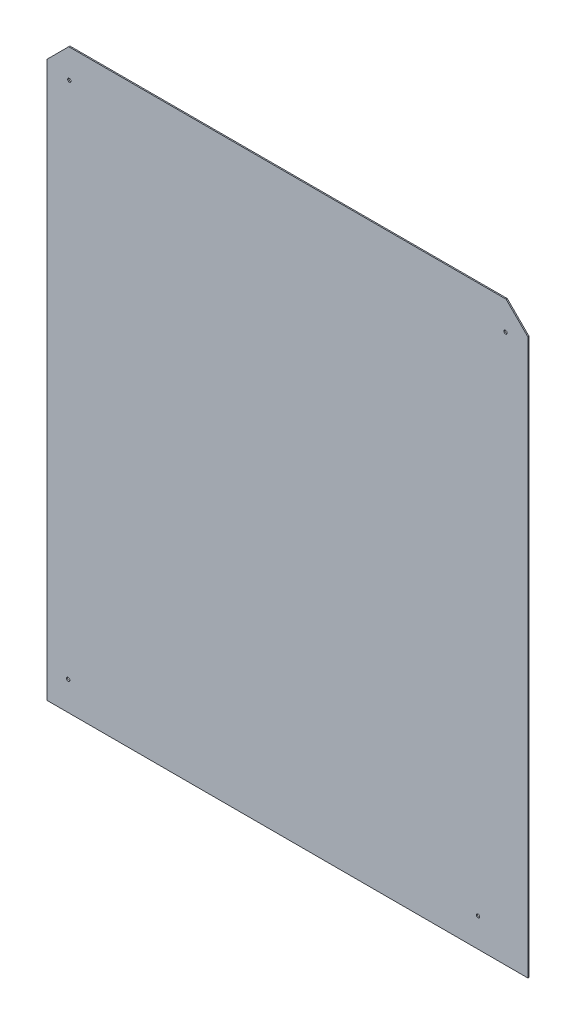
ISO-10303-21;
HEADER;
FILE_DESCRIPTION(('STEP AP214'),'2;1');
FILE_NAME('part.step','',(''),(''),'','','');
FILE_SCHEMA(('AUTOMOTIVE_DESIGN { 1 0 10303 214 1 1 1 1 }'));
ENDSEC;
DATA;
#1=APPLICATION_CONTEXT('core data for automotive mechanical design processes');
#2=APPLICATION_PROTOCOL_DEFINITION('international standard','automotive_design',2000,#1);
#3=PRODUCT_CONTEXT('',#1,'mechanical');
#4=PRODUCT('Part','Part','',(#3));
#5=PRODUCT_RELATED_PRODUCT_CATEGORY('part','',(#4));
#6=PRODUCT_DEFINITION_FORMATION('','',#4);
#7=PRODUCT_DEFINITION_CONTEXT('part definition',#1,'design');
#8=PRODUCT_DEFINITION('design','',#6,#7);
#9=PRODUCT_DEFINITION_SHAPE('','',#8);
#10=(LENGTH_UNIT() NAMED_UNIT(*) SI_UNIT(.MILLI.,.METRE.));
#11=(NAMED_UNIT(*) PLANE_ANGLE_UNIT() SI_UNIT($,.RADIAN.));
#12=(NAMED_UNIT(*) SI_UNIT($,.STERADIAN.) SOLID_ANGLE_UNIT());
#13=UNCERTAINTY_MEASURE_WITH_UNIT(LENGTH_MEASURE(1.E-05),#10,'distance_accuracy_value','');
#14=(GEOMETRIC_REPRESENTATION_CONTEXT(3) GLOBAL_UNCERTAINTY_ASSIGNED_CONTEXT((#13)) GLOBAL_UNIT_ASSIGNED_CONTEXT((#10,
#11,#12)) REPRESENTATION_CONTEXT('',''));
#15=CARTESIAN_POINT('',(0.,0.,0.));
#16=DIRECTION('',(0.,0.,1.));
#17=DIRECTION('',(1.,0.,0.));
#18=AXIS2_PLACEMENT_3D('',#15,#16,#17);
#19=CARTESIAN_POINT('',(0.,0.,-1.4));
#20=DIRECTION('',(-1.,0.,0.));
#21=DIRECTION('',(0.,0.,1.));
#22=AXIS2_PLACEMENT_3D('',#19,#20,#21);
#23=PLANE('',#22);
#24=DIRECTION('',(0.,-1.,0.));
#25=VECTOR('',#24,1.);
#26=CARTESIAN_POINT('',(0.,0.,0.));
#27=LINE('',#26,#25);
#28=CARTESIAN_POINT('',(0.,664.,0.));
#29=VERTEX_POINT('',#28);
#30=CARTESIAN_POINT('',(0.,0.,0.));
#31=VERTEX_POINT('',#30);
#32=EDGE_CURVE('E126',#29,#31,#27,.T.);
#33=ORIENTED_EDGE('',*,*,#32,.F.);
#34=DIRECTION('',(0.,0.,1.));
#35=VECTOR('',#34,1.);
#36=CARTESIAN_POINT('',(0.,664.,-1.4));
#37=LINE('',#36,#35);
#38=CARTESIAN_POINT('',(0.,664.,-1.4));
#39=VERTEX_POINT('',#38);
#40=EDGE_CURVE('E11',#39,#29,#37,.T.);
#41=ORIENTED_EDGE('',*,*,#40,.F.);
#42=DIRECTION('',(0.,-1.,0.));
#43=VECTOR('',#42,1.);
#44=CARTESIAN_POINT('',(0.,0.,-1.4));
#45=LINE('',#44,#43);
#46=CARTESIAN_POINT('',(0.,0.,-1.4));
#47=VERTEX_POINT('',#46);
#48=EDGE_CURVE('E141',#39,#47,#45,.T.);
#49=ORIENTED_EDGE('',*,*,#48,.T.);
#50=DIRECTION('',(0.,0.,1.));
#51=VECTOR('',#50,1.);
#52=CARTESIAN_POINT('',(0.,0.,-1.4));
#53=LINE('',#52,#51);
#54=EDGE_CURVE('E44',#47,#31,#53,.T.);
#55=ORIENTED_EDGE('',*,*,#54,.T.);
#56=EDGE_LOOP('',(#33,#41,#49,#55));
#57=FACE_BOUND('',#56,.T.);
#58=ADVANCED_FACE('F41',(#57),#23,.T.);
#59=CARTESIAN_POINT('',(0.,664.,-1.4));
#60=DIRECTION('',(-0.707106781186548,0.707106781186547,0.));
#61=DIRECTION('',(-0.707106781186547,-0.707106781186548,0.));
#62=AXIS2_PLACEMENT_3D('',#59,#60,#61);
#63=PLANE('',#62);
#64=DIRECTION('',(-0.707106781186547,-0.707106781186548,0.));
#65=VECTOR('',#64,1.);
#66=CARTESIAN_POINT('',(0.,664.,0.));
#67=LINE('',#66,#65);
#68=CARTESIAN_POINT('',(26.,690.,0.));
#69=VERTEX_POINT('',#68);
#70=EDGE_CURVE('E139',#69,#29,#67,.T.);
#71=ORIENTED_EDGE('',*,*,#70,.F.);
#72=DIRECTION('',(0.,0.,1.));
#73=VECTOR('',#72,1.);
#74=CARTESIAN_POINT('',(26.,690.,-1.4));
#75=LINE('',#74,#73);
#76=CARTESIAN_POINT('',(26.,690.,-1.4));
#77=VERTEX_POINT('',#76);
#78=EDGE_CURVE('E50',#77,#69,#75,.T.);
#79=ORIENTED_EDGE('',*,*,#78,.F.);
#80=DIRECTION('',(-0.707106781186547,-0.707106781186548,0.));
#81=VECTOR('',#80,1.);
#82=CARTESIAN_POINT('',(0.,664.,-1.4));
#83=LINE('',#82,#81);
#84=EDGE_CURVE('E116',#77,#39,#83,.T.);
#85=ORIENTED_EDGE('',*,*,#84,.T.);
#86=ORIENTED_EDGE('',*,*,#40,.T.);
#87=EDGE_LOOP('',(#71,#79,#85,#86));
#88=FACE_BOUND('',#87,.T.);
#89=ADVANCED_FACE('F149',(#88),#63,.T.);
#90=CARTESIAN_POINT('',(26.,690.,-1.4));
#91=DIRECTION('',(0.,1.,0.));
#92=DIRECTION('',(0.,0.,1.));
#93=AXIS2_PLACEMENT_3D('',#90,#91,#92);
#94=PLANE('',#93);
#95=DIRECTION('',(-1.,0.,0.));
#96=VECTOR('',#95,1.);
#97=CARTESIAN_POINT('',(26.,690.,0.));
#98=LINE('',#97,#96);
#99=CARTESIAN_POINT('',(549.,690.,0.));
#100=VERTEX_POINT('',#99);
#101=EDGE_CURVE('E103',#100,#69,#98,.T.);
#102=ORIENTED_EDGE('',*,*,#101,.F.);
#103=DIRECTION('',(0.,0.,1.));
#104=VECTOR('',#103,1.);
#105=CARTESIAN_POINT('',(549.,690.,-1.4));
#106=LINE('',#105,#104);
#107=CARTESIAN_POINT('',(549.,690.,-1.4));
#108=VERTEX_POINT('',#107);
#109=EDGE_CURVE('E98',#108,#100,#106,.T.);
#110=ORIENTED_EDGE('',*,*,#109,.F.);
#111=DIRECTION('',(-1.,0.,0.));
#112=VECTOR('',#111,1.);
#113=CARTESIAN_POINT('',(26.,690.,-1.4));
#114=LINE('',#113,#112);
#115=EDGE_CURVE('E101',#108,#77,#114,.T.);
#116=ORIENTED_EDGE('',*,*,#115,.T.);
#117=ORIENTED_EDGE('',*,*,#78,.T.);
#118=EDGE_LOOP('',(#102,#110,#116,#117));
#119=FACE_BOUND('',#118,.T.);
#120=ADVANCED_FACE('F100',(#119),#94,.T.);
#121=CARTESIAN_POINT('',(549.,690.,-1.4));
#122=DIRECTION('',(0.707106781186548,0.707106781186548,0.));
#123=DIRECTION('',(-0.707106781186548,0.707106781186548,0.));
#124=AXIS2_PLACEMENT_3D('',#121,#122,#123);
#125=PLANE('',#124);
#126=DIRECTION('',(-0.707106781186547,0.707106781186547,0.));
#127=VECTOR('',#126,1.);
#128=CARTESIAN_POINT('',(549.,690.,0.));
#129=LINE('',#128,#127);
#130=CARTESIAN_POINT('',(575.,664.,0.));
#131=VERTEX_POINT('',#130);
#132=EDGE_CURVE('E136',#131,#100,#129,.T.);
#133=ORIENTED_EDGE('',*,*,#132,.F.);
#134=DIRECTION('',(0.,0.,1.));
#135=VECTOR('',#134,1.);
#136=CARTESIAN_POINT('',(575.,664.,-1.4));
#137=LINE('',#136,#135);
#138=CARTESIAN_POINT('',(575.,664.,-1.4));
#139=VERTEX_POINT('',#138);
#140=EDGE_CURVE('E108',#139,#131,#137,.T.);
#141=ORIENTED_EDGE('',*,*,#140,.F.);
#142=DIRECTION('',(-0.707106781186547,0.707106781186547,0.));
#143=VECTOR('',#142,1.);
#144=CARTESIAN_POINT('',(549.,690.,-1.4));
#145=LINE('',#144,#143);
#146=EDGE_CURVE('E114',#139,#108,#145,.T.);
#147=ORIENTED_EDGE('',*,*,#146,.T.);
#148=ORIENTED_EDGE('',*,*,#109,.T.);
#149=EDGE_LOOP('',(#133,#141,#147,#148));
#150=FACE_BOUND('',#149,.T.);
#151=ADVANCED_FACE('F118',(#150),#125,.T.);
#152=CARTESIAN_POINT('',(575.,0.,-1.4));
#153=DIRECTION('',(1.,0.,0.));
#154=DIRECTION('',(0.,0.,-1.));
#155=AXIS2_PLACEMENT_3D('',#152,#153,#154);
#156=PLANE('',#155);
#157=DIRECTION('',(0.,1.,0.));
#158=VECTOR('',#157,1.);
#159=CARTESIAN_POINT('',(575.,0.,0.));
#160=LINE('',#159,#158);
#161=CARTESIAN_POINT('',(575.,0.,0.));
#162=VERTEX_POINT('',#161);
#163=EDGE_CURVE('E133',#162,#131,#160,.T.);
#164=ORIENTED_EDGE('',*,*,#163,.F.);
#165=DIRECTION('',(0.,0.,1.));
#166=VECTOR('',#165,1.);
#167=CARTESIAN_POINT('',(575.,0.,-1.4));
#168=LINE('',#167,#166);
#169=CARTESIAN_POINT('',(575.,0.,-1.4));
#170=VERTEX_POINT('',#169);
#171=EDGE_CURVE('E144',#170,#162,#168,.T.);
#172=ORIENTED_EDGE('',*,*,#171,.F.);
#173=DIRECTION('',(0.,1.,0.));
#174=VECTOR('',#173,1.);
#175=CARTESIAN_POINT('',(575.,0.,-1.4));
#176=LINE('',#175,#174);
#177=EDGE_CURVE('E119',#170,#139,#176,.T.);
#178=ORIENTED_EDGE('',*,*,#177,.T.);
#179=ORIENTED_EDGE('',*,*,#140,.T.);
#180=EDGE_LOOP('',(#164,#172,#178,#179));
#181=FACE_BOUND('',#180,.T.);
#182=ADVANCED_FACE('F162',(#181),#156,.T.);
#183=CARTESIAN_POINT('',(0.,0.,-1.4));
#184=DIRECTION('',(0.,-1.,0.));
#185=DIRECTION('',(0.,0.,-1.));
#186=AXIS2_PLACEMENT_3D('',#183,#184,#185);
#187=PLANE('',#186);
#188=DIRECTION('',(1.,0.,0.));
#189=VECTOR('',#188,1.);
#190=CARTESIAN_POINT('',(0.,0.,0.));
#191=LINE('',#190,#189);
#192=EDGE_CURVE('E129',#31,#162,#191,.T.);
#193=ORIENTED_EDGE('',*,*,#192,.F.);
#194=ORIENTED_EDGE('',*,*,#54,.F.);
#195=DIRECTION('',(1.,0.,0.));
#196=VECTOR('',#195,1.);
#197=CARTESIAN_POINT('',(0.,0.,-1.4));
#198=LINE('',#197,#196);
#199=EDGE_CURVE('E121',#47,#170,#198,.T.);
#200=ORIENTED_EDGE('',*,*,#199,.T.);
#201=ORIENTED_EDGE('',*,*,#171,.T.);
#202=EDGE_LOOP('',(#193,#194,#200,#201));
#203=FACE_BOUND('',#202,.T.);
#204=ADVANCED_FACE('F146',(#203),#187,.T.);
#205=CARTESIAN_POINT('',(0.,0.,-1.4));
#206=DIRECTION('',(0.,0.,-1.));
#207=DIRECTION('',(-1.,0.,0.));
#208=AXIS2_PLACEMENT_3D('',#205,#206,#207);
#209=PLANE('',#208);
#210=CARTESIAN_POINT('',(548.3,655.5,-1.4));
#211=DIRECTION('',(0.,0.,-1.));
#212=DIRECTION('',(-1.,0.,0.));
#213=AXIS2_PLACEMENT_3D('',#210,#211,#212);
#214=CIRCLE('',#213,2.);
#215=CARTESIAN_POINT('',(546.3,655.5,-1.4));
#216=VERTEX_POINT('',#215);
#217=EDGE_CURVE('E213',#216,#216,#214,.F.);
#218=ORIENTED_EDGE('',*,*,#217,.T.);
#219=EDGE_LOOP('',(#218));
#220=FACE_BOUND('',#219,.T.);
#221=CARTESIAN_POINT('',(25.3,34.5,-1.4));
#222=DIRECTION('',(0.,0.,-1.));
#223=DIRECTION('',(-1.,0.,0.));
#224=AXIS2_PLACEMENT_3D('',#221,#222,#223);
#225=CIRCLE('',#224,2.);
#226=CARTESIAN_POINT('',(23.3,34.5,-1.4));
#227=VERTEX_POINT('',#226);
#228=EDGE_CURVE('E202',#227,#227,#225,.F.);
#229=ORIENTED_EDGE('',*,*,#228,.T.);
#230=EDGE_LOOP('',(#229));
#231=FACE_BOUND('',#230,.T.);
#232=CARTESIAN_POINT('',(515.5,34.5,-1.4));
#233=DIRECTION('',(0.,0.,-1.));
#234=DIRECTION('',(-1.,0.,0.));
#235=AXIS2_PLACEMENT_3D('',#232,#233,#234);
#236=CIRCLE('',#235,2.);
#237=CARTESIAN_POINT('',(513.5,34.5,-1.4));
#238=VERTEX_POINT('',#237);
#239=EDGE_CURVE('E197',#238,#238,#236,.F.);
#240=ORIENTED_EDGE('',*,*,#239,.T.);
#241=EDGE_LOOP('',(#240));
#242=FACE_BOUND('',#241,.T.);
#243=CARTESIAN_POINT('',(26.7,655.5,-1.4));
#244=DIRECTION('',(0.,0.,-1.));
#245=DIRECTION('',(-1.,0.,0.));
#246=AXIS2_PLACEMENT_3D('',#243,#244,#245);
#247=CIRCLE('',#246,2.);
#248=CARTESIAN_POINT('',(24.7,655.5,-1.4));
#249=VERTEX_POINT('',#248);
#250=EDGE_CURVE('E212',#249,#249,#247,.F.);
#251=ORIENTED_EDGE('',*,*,#250,.T.);
#252=EDGE_LOOP('',(#251));
#253=FACE_BOUND('',#252,.T.);
#254=ORIENTED_EDGE('',*,*,#48,.F.);
#255=ORIENTED_EDGE('',*,*,#84,.F.);
#256=ORIENTED_EDGE('',*,*,#115,.F.);
#257=ORIENTED_EDGE('',*,*,#146,.F.);
#258=ORIENTED_EDGE('',*,*,#177,.F.);
#259=ORIENTED_EDGE('',*,*,#199,.F.);
#260=EDGE_LOOP('',(#254,#255,#256,#257,#258,#259));
#261=FACE_BOUND('',#260,.T.);
#262=ADVANCED_FACE('F112',(#220,#231,#242,#253,#261),#209,.T.);
#263=CARTESIAN_POINT('',(0.,0.,0.));
#264=DIRECTION('',(0.,0.,-1.));
#265=DIRECTION('',(-1.,0.,0.));
#266=AXIS2_PLACEMENT_3D('',#263,#264,#265);
#267=PLANE('',#266);
#268=CARTESIAN_POINT('',(548.3,655.5,0.));
#269=DIRECTION('',(0.,0.,1.));
#270=DIRECTION('',(1.,0.,0.));
#271=AXIS2_PLACEMENT_3D('',#268,#269,#270);
#272=CIRCLE('',#271,2.);
#273=CARTESIAN_POINT('',(550.3,655.5,0.));
#274=VERTEX_POINT('',#273);
#275=EDGE_CURVE('E209',#274,#274,#272,.T.);
#276=ORIENTED_EDGE('',*,*,#275,.F.);
#277=EDGE_LOOP('',(#276));
#278=FACE_BOUND('',#277,.T.);
#279=CARTESIAN_POINT('',(25.3,34.5,0.));
#280=DIRECTION('',(0.,0.,1.));
#281=DIRECTION('',(1.,0.,0.));
#282=AXIS2_PLACEMENT_3D('',#279,#280,#281);
#283=CIRCLE('',#282,2.);
#284=CARTESIAN_POINT('',(27.3,34.5,0.));
#285=VERTEX_POINT('',#284);
#286=EDGE_CURVE('E205',#285,#285,#283,.T.);
#287=ORIENTED_EDGE('',*,*,#286,.F.);
#288=EDGE_LOOP('',(#287));
#289=FACE_BOUND('',#288,.T.);
#290=CARTESIAN_POINT('',(515.5,34.5,0.));
#291=DIRECTION('',(0.,0.,1.));
#292=DIRECTION('',(1.,0.,0.));
#293=AXIS2_PLACEMENT_3D('',#290,#291,#292);
#294=CIRCLE('',#293,2.);
#295=CARTESIAN_POINT('',(517.5,34.5,0.));
#296=VERTEX_POINT('',#295);
#297=EDGE_CURVE('E200',#296,#296,#294,.T.);
#298=ORIENTED_EDGE('',*,*,#297,.F.);
#299=EDGE_LOOP('',(#298));
#300=FACE_BOUND('',#299,.T.);
#301=CARTESIAN_POINT('',(26.7,655.5,0.));
#302=DIRECTION('',(0.,0.,1.));
#303=DIRECTION('',(1.,0.,0.));
#304=AXIS2_PLACEMENT_3D('',#301,#302,#303);
#305=CIRCLE('',#304,2.);
#306=CARTESIAN_POINT('',(28.7,655.5,0.));
#307=VERTEX_POINT('',#306);
#308=EDGE_CURVE('E130',#307,#307,#305,.T.);
#309=ORIENTED_EDGE('',*,*,#308,.F.);
#310=EDGE_LOOP('',(#309));
#311=FACE_BOUND('',#310,.T.);
#312=ORIENTED_EDGE('',*,*,#32,.T.);
#313=ORIENTED_EDGE('',*,*,#192,.T.);
#314=ORIENTED_EDGE('',*,*,#163,.T.);
#315=ORIENTED_EDGE('',*,*,#132,.T.);
#316=ORIENTED_EDGE('',*,*,#101,.T.);
#317=ORIENTED_EDGE('',*,*,#70,.T.);
#318=EDGE_LOOP('',(#312,#313,#314,#315,#316,#317));
#319=FACE_BOUND('',#318,.T.);
#320=ADVANCED_FACE('F148',(#278,#289,#300,#311,#319),#267,.F.);
#321=CARTESIAN_POINT('',(26.7,655.5,-1.401));
#322=DIRECTION('',(0.,0.,1.));
#323=DIRECTION('',(1.,0.,0.));
#324=AXIS2_PLACEMENT_3D('',#321,#322,#323);
#325=CYLINDRICAL_SURFACE('',#324,2.);
#326=ORIENTED_EDGE('',*,*,#250,.F.);
#327=EDGE_LOOP('',(#326));
#328=FACE_BOUND('',#327,.T.);
#329=ORIENTED_EDGE('',*,*,#308,.T.);
#330=EDGE_LOOP('',(#329));
#331=FACE_BOUND('',#330,.T.);
#332=ADVANCED_FACE('F173',(#328,#331),#325,.F.);
#333=CARTESIAN_POINT('',(515.5,34.5,-1.401));
#334=DIRECTION('',(0.,0.,1.));
#335=DIRECTION('',(1.,0.,0.));
#336=AXIS2_PLACEMENT_3D('',#333,#334,#335);
#337=CYLINDRICAL_SURFACE('',#336,2.);
#338=ORIENTED_EDGE('',*,*,#239,.F.);
#339=EDGE_LOOP('',(#338));
#340=FACE_BOUND('',#339,.T.);
#341=ORIENTED_EDGE('',*,*,#297,.T.);
#342=EDGE_LOOP('',(#341));
#343=FACE_BOUND('',#342,.T.);
#344=ADVANCED_FACE('F180',(#340,#343),#337,.F.);
#345=CARTESIAN_POINT('',(25.3,34.5,-1.401));
#346=DIRECTION('',(0.,0.,1.));
#347=DIRECTION('',(1.,0.,0.));
#348=AXIS2_PLACEMENT_3D('',#345,#346,#347);
#349=CYLINDRICAL_SURFACE('',#348,2.);
#350=ORIENTED_EDGE('',*,*,#228,.F.);
#351=EDGE_LOOP('',(#350));
#352=FACE_BOUND('',#351,.T.);
#353=ORIENTED_EDGE('',*,*,#286,.T.);
#354=EDGE_LOOP('',(#353));
#355=FACE_BOUND('',#354,.T.);
#356=ADVANCED_FACE('F182',(#352,#355),#349,.F.);
#357=CARTESIAN_POINT('',(548.3,655.5,-1.401));
#358=DIRECTION('',(0.,0.,1.));
#359=DIRECTION('',(1.,0.,0.));
#360=AXIS2_PLACEMENT_3D('',#357,#358,#359);
#361=CYLINDRICAL_SURFACE('',#360,2.);
#362=ORIENTED_EDGE('',*,*,#217,.F.);
#363=EDGE_LOOP('',(#362));
#364=FACE_BOUND('',#363,.T.);
#365=ORIENTED_EDGE('',*,*,#275,.T.);
#366=EDGE_LOOP('',(#365));
#367=FACE_BOUND('',#366,.T.);
#368=ADVANCED_FACE('F185',(#364,#367),#361,.F.);
#369=CLOSED_SHELL('',(#58,#89,#120,#151,#182,#204,#262,#320,#332,#344,#356,#368));
#370=MANIFOLD_SOLID_BREP('B2',#369);
#371=ADVANCED_BREP_SHAPE_REPRESENTATION('',(#18,#370),#14);
#372=SHAPE_DEFINITION_REPRESENTATION(#9,#371);
ENDSEC;
END-ISO-10303-21;
